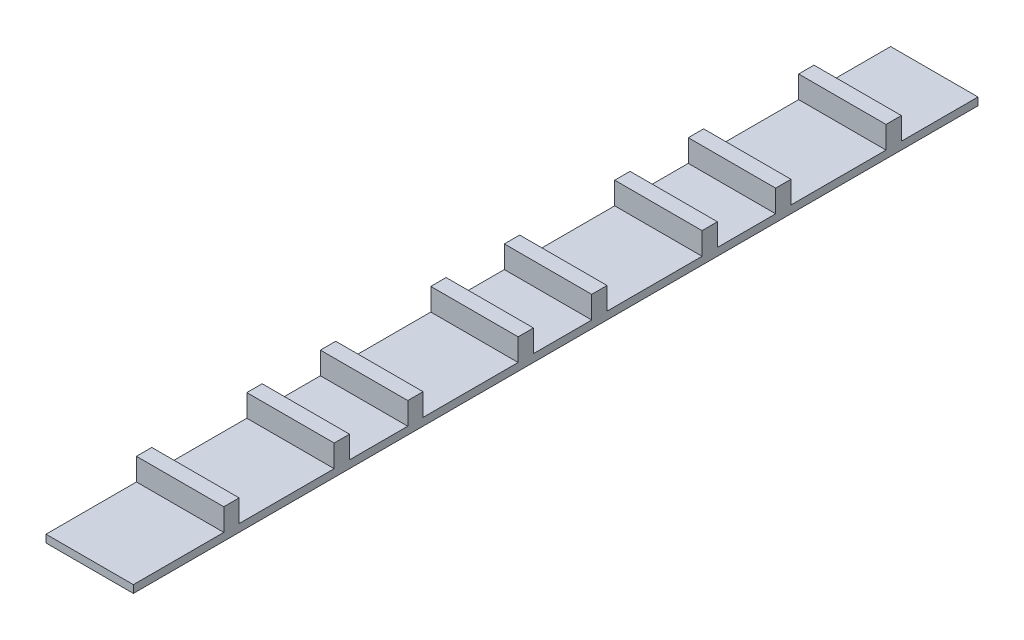
ISO-10303-21;
HEADER;
FILE_DESCRIPTION(('STEP AP214'),'2;1');
FILE_NAME('part.step','',(''),(''),'','','');
FILE_SCHEMA(('AUTOMOTIVE_DESIGN { 1 0 10303 214 1 1 1 1 }'));
ENDSEC;
DATA;
#1=APPLICATION_CONTEXT('core data for automotive mechanical design processes');
#2=APPLICATION_PROTOCOL_DEFINITION('international standard','automotive_design',2000,#1);
#3=PRODUCT_CONTEXT('',#1,'mechanical');
#4=PRODUCT('Part','Part','',(#3));
#5=PRODUCT_RELATED_PRODUCT_CATEGORY('part','',(#4));
#6=PRODUCT_DEFINITION_FORMATION('','',#4);
#7=PRODUCT_DEFINITION_CONTEXT('part definition',#1,'design');
#8=PRODUCT_DEFINITION('design','',#6,#7);
#9=PRODUCT_DEFINITION_SHAPE('','',#8);
#10=(LENGTH_UNIT() NAMED_UNIT(*) SI_UNIT(.MILLI.,.METRE.));
#11=(NAMED_UNIT(*) PLANE_ANGLE_UNIT() SI_UNIT($,.RADIAN.));
#12=(NAMED_UNIT(*) SI_UNIT($,.STERADIAN.) SOLID_ANGLE_UNIT());
#13=UNCERTAINTY_MEASURE_WITH_UNIT(LENGTH_MEASURE(1.E-05),#10,'distance_accuracy_value','');
#14=(GEOMETRIC_REPRESENTATION_CONTEXT(3) GLOBAL_UNCERTAINTY_ASSIGNED_CONTEXT((#13)) GLOBAL_UNIT_ASSIGNED_CONTEXT((#10,
#11,#12)) REPRESENTATION_CONTEXT('',''));
#15=CARTESIAN_POINT('',(0.,0.,0.));
#16=DIRECTION('',(0.,0.,1.));
#17=DIRECTION('',(1.,0.,0.));
#18=AXIS2_PLACEMENT_3D('',#15,#16,#17);
#19=CARTESIAN_POINT('',(0.,0.5,55.1));
#20=DIRECTION('',(0.,-1.,0.));
#21=DIRECTION('',(0.,0.,-1.));
#22=AXIS2_PLACEMENT_3D('',#19,#20,#21);
#23=PLANE('',#22);
#24=DIRECTION('',(1.,0.,0.));
#25=VECTOR('',#24,1.);
#26=CARTESIAN_POINT('',(0.,0.5,49.2));
#27=LINE('',#26,#25);
#28=CARTESIAN_POINT('',(0.,0.5,49.2));
#29=VERTEX_POINT('',#28);
#30=CARTESIAN_POINT('',(5.7,0.5,49.2));
#31=VERTEX_POINT('',#30);
#32=EDGE_CURVE('E65',#29,#31,#27,.T.);
#33=ORIENTED_EDGE('',*,*,#32,.F.);
#34=DIRECTION('',(0.,0.,-1.));
#35=VECTOR('',#34,1.);
#36=CARTESIAN_POINT('',(0.,0.5,55.1));
#37=LINE('',#36,#35);
#38=CARTESIAN_POINT('',(0.,0.5,55.1));
#39=VERTEX_POINT('',#38);
#40=EDGE_CURVE('E302',#39,#29,#37,.T.);
#41=ORIENTED_EDGE('',*,*,#40,.F.);
#42=DIRECTION('',(-1.,0.,0.));
#43=VECTOR('',#42,1.);
#44=CARTESIAN_POINT('',(0.,0.5,55.1));
#45=LINE('',#44,#43);
#46=CARTESIAN_POINT('',(5.7,0.5,55.1));
#47=VERTEX_POINT('',#46);
#48=EDGE_CURVE('E581',#47,#39,#45,.T.);
#49=ORIENTED_EDGE('',*,*,#48,.F.);
#50=DIRECTION('',(0.,0.,-1.));
#51=VECTOR('',#50,1.);
#52=CARTESIAN_POINT('',(5.7,0.5,55.1));
#53=LINE('',#52,#51);
#54=EDGE_CURVE('E600',#47,#31,#53,.T.);
#55=ORIENTED_EDGE('',*,*,#54,.T.);
#56=EDGE_LOOP('',(#33,#41,#49,#55));
#57=FACE_BOUND('',#56,.T.);
#58=ADVANCED_FACE('F41',(#57),#23,.F.);
#59=DIRECTION('',(-1.,0.,0.));
#60=VECTOR('',#59,1.);
#61=CARTESIAN_POINT('',(0.,0.5,48.2));
#62=LINE('',#61,#60);
#63=CARTESIAN_POINT('',(5.7,0.5,48.2));
#64=VERTEX_POINT('',#63);
#65=CARTESIAN_POINT('',(0.,0.5,48.2));
#66=VERTEX_POINT('',#65);
#67=EDGE_CURVE('E298',#64,#66,#62,.T.);
#68=ORIENTED_EDGE('',*,*,#67,.F.);
#69=CARTESIAN_POINT('',(5.7,0.5,42.));
#70=VERTEX_POINT('',#69);
#71=EDGE_CURVE('E602',#64,#70,#53,.T.);
#72=ORIENTED_EDGE('',*,*,#71,.T.);
#73=DIRECTION('',(1.,0.,0.));
#74=VECTOR('',#73,1.);
#75=CARTESIAN_POINT('',(0.,0.5,42.));
#76=LINE('',#75,#74);
#77=CARTESIAN_POINT('',(0.,0.5,42.));
#78=VERTEX_POINT('',#77);
#79=EDGE_CURVE('E304',#78,#70,#76,.T.);
#80=ORIENTED_EDGE('',*,*,#79,.F.);
#81=EDGE_CURVE('E57',#66,#78,#37,.T.);
#82=ORIENTED_EDGE('',*,*,#81,.F.);
#83=EDGE_LOOP('',(#68,#72,#80,#82));
#84=FACE_BOUND('',#83,.T.);
#85=ADVANCED_FACE('F652',(#84),#23,.F.);
#86=DIRECTION('',(-1.,0.,0.));
#87=VECTOR('',#86,1.);
#88=CARTESIAN_POINT('',(0.,0.5,41.));
#89=LINE('',#88,#87);
#90=CARTESIAN_POINT('',(5.7,0.5,41.));
#91=VERTEX_POINT('',#90);
#92=CARTESIAN_POINT('',(0.,0.5,41.));
#93=VERTEX_POINT('',#92);
#94=EDGE_CURVE('E309',#91,#93,#89,.T.);
#95=ORIENTED_EDGE('',*,*,#94,.F.);
#96=CARTESIAN_POINT('',(5.7,0.5,37.2));
#97=VERTEX_POINT('',#96);
#98=EDGE_CURVE('E643',#91,#97,#53,.T.);
#99=ORIENTED_EDGE('',*,*,#98,.T.);
#100=DIRECTION('',(1.,0.,0.));
#101=VECTOR('',#100,1.);
#102=CARTESIAN_POINT('',(0.,0.5,37.2));
#103=LINE('',#102,#101);
#104=CARTESIAN_POINT('',(0.,0.5,37.2));
#105=VERTEX_POINT('',#104);
#106=EDGE_CURVE('E347',#105,#97,#103,.T.);
#107=ORIENTED_EDGE('',*,*,#106,.F.);
#108=EDGE_CURVE('E668',#93,#105,#37,.T.);
#109=ORIENTED_EDGE('',*,*,#108,.F.);
#110=EDGE_LOOP('',(#95,#99,#107,#109));
#111=FACE_BOUND('',#110,.T.);
#112=ADVANCED_FACE('F764',(#111),#23,.F.);
#113=DIRECTION('',(-1.,0.,0.));
#114=VECTOR('',#113,1.);
#115=CARTESIAN_POINT('',(0.,0.5,36.2));
#116=LINE('',#115,#114);
#117=CARTESIAN_POINT('',(5.7,0.5,36.2));
#118=VERTEX_POINT('',#117);
#119=CARTESIAN_POINT('',(0.,0.5,36.2));
#120=VERTEX_POINT('',#119);
#121=EDGE_CURVE('E353',#118,#120,#116,.T.);
#122=ORIENTED_EDGE('',*,*,#121,.F.);
#123=CARTESIAN_POINT('',(5.7,0.5,30.));
#124=VERTEX_POINT('',#123);
#125=EDGE_CURVE('E638',#118,#124,#53,.T.);
#126=ORIENTED_EDGE('',*,*,#125,.T.);
#127=DIRECTION('',(1.,0.,0.));
#128=VECTOR('',#127,1.);
#129=CARTESIAN_POINT('',(0.,0.5,30.));
#130=LINE('',#129,#128);
#131=CARTESIAN_POINT('',(0.,0.5,30.));
#132=VERTEX_POINT('',#131);
#133=EDGE_CURVE('E384',#132,#124,#130,.T.);
#134=ORIENTED_EDGE('',*,*,#133,.F.);
#135=EDGE_CURVE('E670',#120,#132,#37,.T.);
#136=ORIENTED_EDGE('',*,*,#135,.F.);
#137=EDGE_LOOP('',(#122,#126,#134,#136));
#138=FACE_BOUND('',#137,.T.);
#139=ADVANCED_FACE('F752',(#138),#23,.F.);
#140=DIRECTION('',(-1.,0.,0.));
#141=VECTOR('',#140,1.);
#142=CARTESIAN_POINT('',(0.,0.5,29.));
#143=LINE('',#142,#141);
#144=CARTESIAN_POINT('',(5.7,0.5,29.));
#145=VERTEX_POINT('',#144);
#146=CARTESIAN_POINT('',(0.,0.5,29.));
#147=VERTEX_POINT('',#146);
#148=EDGE_CURVE('E390',#145,#147,#143,.T.);
#149=ORIENTED_EDGE('',*,*,#148,.F.);
#150=CARTESIAN_POINT('',(5.7,0.5,25.2));
#151=VERTEX_POINT('',#150);
#152=EDGE_CURVE('E633',#145,#151,#53,.T.);
#153=ORIENTED_EDGE('',*,*,#152,.T.);
#154=DIRECTION('',(1.,0.,0.));
#155=VECTOR('',#154,1.);
#156=CARTESIAN_POINT('',(0.,0.5,25.2));
#157=LINE('',#156,#155);
#158=CARTESIAN_POINT('',(0.,0.5,25.2));
#159=VERTEX_POINT('',#158);
#160=EDGE_CURVE('E421',#159,#151,#157,.T.);
#161=ORIENTED_EDGE('',*,*,#160,.F.);
#162=EDGE_CURVE('E673',#147,#159,#37,.T.);
#163=ORIENTED_EDGE('',*,*,#162,.F.);
#164=EDGE_LOOP('',(#149,#153,#161,#163));
#165=FACE_BOUND('',#164,.T.);
#166=ADVANCED_FACE('F739',(#165),#23,.F.);
#167=DIRECTION('',(-1.,0.,0.));
#168=VECTOR('',#167,1.);
#169=CARTESIAN_POINT('',(0.,0.5,24.2));
#170=LINE('',#169,#168);
#171=CARTESIAN_POINT('',(5.7,0.5,24.2));
#172=VERTEX_POINT('',#171);
#173=CARTESIAN_POINT('',(0.,0.5,24.2));
#174=VERTEX_POINT('',#173);
#175=EDGE_CURVE('E427',#172,#174,#170,.T.);
#176=ORIENTED_EDGE('',*,*,#175,.F.);
#177=CARTESIAN_POINT('',(5.7,0.5,18.));
#178=VERTEX_POINT('',#177);
#179=EDGE_CURVE('E628',#172,#178,#53,.T.);
#180=ORIENTED_EDGE('',*,*,#179,.T.);
#181=DIRECTION('',(1.,0.,0.));
#182=VECTOR('',#181,1.);
#183=CARTESIAN_POINT('',(0.,0.5,18.));
#184=LINE('',#183,#182);
#185=CARTESIAN_POINT('',(0.,0.5,18.));
#186=VERTEX_POINT('',#185);
#187=EDGE_CURVE('E458',#186,#178,#184,.T.);
#188=ORIENTED_EDGE('',*,*,#187,.F.);
#189=EDGE_CURVE('E676',#174,#186,#37,.T.);
#190=ORIENTED_EDGE('',*,*,#189,.F.);
#191=EDGE_LOOP('',(#176,#180,#188,#190));
#192=FACE_BOUND('',#191,.T.);
#193=ADVANCED_FACE('F726',(#192),#23,.F.);
#194=DIRECTION('',(-1.,0.,0.));
#195=VECTOR('',#194,1.);
#196=CARTESIAN_POINT('',(0.,0.5,17.));
#197=LINE('',#196,#195);
#198=CARTESIAN_POINT('',(5.7,0.5,17.));
#199=VERTEX_POINT('',#198);
#200=CARTESIAN_POINT('',(0.,0.5,17.));
#201=VERTEX_POINT('',#200);
#202=EDGE_CURVE('E464',#199,#201,#197,.T.);
#203=ORIENTED_EDGE('',*,*,#202,.F.);
#204=CARTESIAN_POINT('',(5.7,0.5,13.2));
#205=VERTEX_POINT('',#204);
#206=EDGE_CURVE('E623',#199,#205,#53,.T.);
#207=ORIENTED_EDGE('',*,*,#206,.T.);
#208=DIRECTION('',(1.,0.,0.));
#209=VECTOR('',#208,1.);
#210=CARTESIAN_POINT('',(0.,0.5,13.2));
#211=LINE('',#210,#209);
#212=CARTESIAN_POINT('',(0.,0.5,13.2));
#213=VERTEX_POINT('',#212);
#214=EDGE_CURVE('E495',#213,#205,#211,.T.);
#215=ORIENTED_EDGE('',*,*,#214,.F.);
#216=EDGE_CURVE('E679',#201,#213,#37,.T.);
#217=ORIENTED_EDGE('',*,*,#216,.F.);
#218=EDGE_LOOP('',(#203,#207,#215,#217));
#219=FACE_BOUND('',#218,.T.);
#220=ADVANCED_FACE('F713',(#219),#23,.F.);
#221=DIRECTION('',(-1.,0.,0.));
#222=VECTOR('',#221,1.);
#223=CARTESIAN_POINT('',(0.,0.5,12.2));
#224=LINE('',#223,#222);
#225=CARTESIAN_POINT('',(5.7,0.5,12.2));
#226=VERTEX_POINT('',#225);
#227=CARTESIAN_POINT('',(0.,0.5,12.2));
#228=VERTEX_POINT('',#227);
#229=EDGE_CURVE('E501',#226,#228,#224,.T.);
#230=ORIENTED_EDGE('',*,*,#229,.F.);
#231=CARTESIAN_POINT('',(5.7,0.5,6.));
#232=VERTEX_POINT('',#231);
#233=EDGE_CURVE('E621',#226,#232,#53,.T.);
#234=ORIENTED_EDGE('',*,*,#233,.T.);
#235=DIRECTION('',(1.,0.,0.));
#236=VECTOR('',#235,1.);
#237=CARTESIAN_POINT('',(0.,0.5,6.));
#238=LINE('',#237,#236);
#239=CARTESIAN_POINT('',(0.,0.5,6.));
#240=VERTEX_POINT('',#239);
#241=EDGE_CURVE('E532',#240,#232,#238,.T.);
#242=ORIENTED_EDGE('',*,*,#241,.F.);
#243=EDGE_CURVE('E682',#228,#240,#37,.T.);
#244=ORIENTED_EDGE('',*,*,#243,.F.);
#245=EDGE_LOOP('',(#230,#234,#242,#244));
#246=FACE_BOUND('',#245,.T.);
#247=ADVANCED_FACE('F699',(#246),#23,.F.);
#248=DIRECTION('',(-1.,0.,0.));
#249=VECTOR('',#248,1.);
#250=CARTESIAN_POINT('',(0.,0.5,5.));
#251=LINE('',#250,#249);
#252=CARTESIAN_POINT('',(5.7,0.5,5.));
#253=VERTEX_POINT('',#252);
#254=CARTESIAN_POINT('',(0.,0.5,5.));
#255=VERTEX_POINT('',#254);
#256=EDGE_CURVE('E538',#253,#255,#251,.T.);
#257=ORIENTED_EDGE('',*,*,#256,.F.);
#258=CARTESIAN_POINT('',(5.7,0.5,0.));
#259=VERTEX_POINT('',#258);
#260=EDGE_CURVE('E599',#253,#259,#53,.T.);
#261=ORIENTED_EDGE('',*,*,#260,.T.);
#262=DIRECTION('',(-1.,0.,0.));
#263=VECTOR('',#262,1.);
#264=CARTESIAN_POINT('',(0.,0.5,0.));
#265=LINE('',#264,#263);
#266=CARTESIAN_POINT('',(0.,0.5,0.));
#267=VERTEX_POINT('',#266);
#268=EDGE_CURVE('E575',#259,#267,#265,.T.);
#269=ORIENTED_EDGE('',*,*,#268,.T.);
#270=EDGE_CURVE('E584',#255,#267,#37,.T.);
#271=ORIENTED_EDGE('',*,*,#270,.F.);
#272=EDGE_LOOP('',(#257,#261,#269,#271));
#273=FACE_BOUND('',#272,.T.);
#274=ADVANCED_FACE('F618',(#273),#23,.F.);
#275=CARTESIAN_POINT('',(0.,0.,55.1));
#276=DIRECTION('',(1.,0.,0.));
#277=DIRECTION('',(0.,0.,-1.));
#278=AXIS2_PLACEMENT_3D('',#275,#276,#277);
#279=PLANE('',#278);
#280=DIRECTION('',(0.,-1.,0.));
#281=VECTOR('',#280,1.);
#282=CARTESIAN_POINT('',(0.,0.,0.));
#283=LINE('',#282,#281);
#284=CARTESIAN_POINT('',(0.,0.,0.));
#285=VERTEX_POINT('',#284);
#286=EDGE_CURVE('E569',#267,#285,#283,.T.);
#287=ORIENTED_EDGE('',*,*,#286,.T.);
#288=DIRECTION('',(0.,0.,-1.));
#289=VECTOR('',#288,1.);
#290=CARTESIAN_POINT('',(0.,0.,55.1));
#291=LINE('',#290,#289);
#292=CARTESIAN_POINT('',(0.,0.,55.1));
#293=VERTEX_POINT('',#292);
#294=EDGE_CURVE('E11',#293,#285,#291,.T.);
#295=ORIENTED_EDGE('',*,*,#294,.F.);
#296=DIRECTION('',(0.,-1.,0.));
#297=VECTOR('',#296,1.);
#298=CARTESIAN_POINT('',(0.,0.,55.1));
#299=LINE('',#298,#297);
#300=EDGE_CURVE('E570',#39,#293,#299,.T.);
#301=ORIENTED_EDGE('',*,*,#300,.F.);
#302=ORIENTED_EDGE('',*,*,#40,.T.);
#303=DIRECTION('',(0.,-1.,0.));
#304=VECTOR('',#303,1.);
#305=CARTESIAN_POINT('',(0.,1.95,49.2));
#306=LINE('',#305,#304);
#307=CARTESIAN_POINT('',(0.,1.95,49.2));
#308=VERTEX_POINT('',#307);
#309=EDGE_CURVE('E281',#308,#29,#306,.T.);
#310=ORIENTED_EDGE('',*,*,#309,.F.);
#311=DIRECTION('',(0.,0.,1.));
#312=VECTOR('',#311,1.);
#313=CARTESIAN_POINT('',(0.,1.95,48.2));
#314=LINE('',#313,#312);
#315=CARTESIAN_POINT('',(0.,1.95,48.2));
#316=VERTEX_POINT('',#315);
#317=EDGE_CURVE('E288',#316,#308,#314,.T.);
#318=ORIENTED_EDGE('',*,*,#317,.F.);
#319=DIRECTION('',(0.,-1.,0.));
#320=VECTOR('',#319,1.);
#321=CARTESIAN_POINT('',(0.,1.95,48.2));
#322=LINE('',#321,#320);
#323=EDGE_CURVE('E666',#316,#66,#322,.T.);
#324=ORIENTED_EDGE('',*,*,#323,.T.);
#325=ORIENTED_EDGE('',*,*,#81,.T.);
#326=DIRECTION('',(0.,-1.,0.));
#327=VECTOR('',#326,1.);
#328=CARTESIAN_POINT('',(0.,1.95,42.));
#329=LINE('',#328,#327);
#330=CARTESIAN_POINT('',(0.,1.95,42.));
#331=VERTEX_POINT('',#330);
#332=EDGE_CURVE('E343',#331,#78,#329,.T.);
#333=ORIENTED_EDGE('',*,*,#332,.F.);
#334=DIRECTION('',(0.,0.,1.));
#335=VECTOR('',#334,1.);
#336=CARTESIAN_POINT('',(0.,1.95,41.));
#337=LINE('',#336,#335);
#338=CARTESIAN_POINT('',(0.,1.95,41.));
#339=VERTEX_POINT('',#338);
#340=EDGE_CURVE('E315',#339,#331,#337,.T.);
#341=ORIENTED_EDGE('',*,*,#340,.F.);
#342=DIRECTION('',(0.,-1.,0.));
#343=VECTOR('',#342,1.);
#344=CARTESIAN_POINT('',(0.,1.95,41.));
#345=LINE('',#344,#343);
#346=EDGE_CURVE('E327',#339,#93,#345,.T.);
#347=ORIENTED_EDGE('',*,*,#346,.T.);
#348=ORIENTED_EDGE('',*,*,#108,.T.);
#349=DIRECTION('',(0.,-1.,0.));
#350=VECTOR('',#349,1.);
#351=CARTESIAN_POINT('',(0.,1.95,37.2));
#352=LINE('',#351,#350);
#353=CARTESIAN_POINT('',(0.,1.95,37.2));
#354=VERTEX_POINT('',#353);
#355=EDGE_CURVE('E380',#354,#105,#352,.T.);
#356=ORIENTED_EDGE('',*,*,#355,.F.);
#357=DIRECTION('',(0.,0.,1.));
#358=VECTOR('',#357,1.);
#359=CARTESIAN_POINT('',(0.,1.95,36.2));
#360=LINE('',#359,#358);
#361=CARTESIAN_POINT('',(0.,1.95,36.2));
#362=VERTEX_POINT('',#361);
#363=EDGE_CURVE('E348',#362,#354,#360,.T.);
#364=ORIENTED_EDGE('',*,*,#363,.F.);
#365=DIRECTION('',(0.,-1.,0.));
#366=VECTOR('',#365,1.);
#367=CARTESIAN_POINT('',(0.,1.95,36.2));
#368=LINE('',#367,#366);
#369=EDGE_CURVE('E362',#362,#120,#368,.T.);
#370=ORIENTED_EDGE('',*,*,#369,.T.);
#371=ORIENTED_EDGE('',*,*,#135,.T.);
#372=DIRECTION('',(0.,-1.,0.));
#373=VECTOR('',#372,1.);
#374=CARTESIAN_POINT('',(0.,1.95,30.));
#375=LINE('',#374,#373);
#376=CARTESIAN_POINT('',(0.,1.95,30.));
#377=VERTEX_POINT('',#376);
#378=EDGE_CURVE('E417',#377,#132,#375,.T.);
#379=ORIENTED_EDGE('',*,*,#378,.F.);
#380=DIRECTION('',(0.,0.,1.));
#381=VECTOR('',#380,1.);
#382=CARTESIAN_POINT('',(0.,1.95,29.));
#383=LINE('',#382,#381);
#384=CARTESIAN_POINT('',(0.,1.95,29.));
#385=VERTEX_POINT('',#384);
#386=EDGE_CURVE('E385',#385,#377,#383,.T.);
#387=ORIENTED_EDGE('',*,*,#386,.F.);
#388=DIRECTION('',(0.,-1.,0.));
#389=VECTOR('',#388,1.);
#390=CARTESIAN_POINT('',(0.,1.95,29.));
#391=LINE('',#390,#389);
#392=EDGE_CURVE('E399',#385,#147,#391,.T.);
#393=ORIENTED_EDGE('',*,*,#392,.T.);
#394=ORIENTED_EDGE('',*,*,#162,.T.);
#395=DIRECTION('',(0.,-1.,0.));
#396=VECTOR('',#395,1.);
#397=CARTESIAN_POINT('',(0.,1.95,25.2));
#398=LINE('',#397,#396);
#399=CARTESIAN_POINT('',(0.,1.95,25.2));
#400=VERTEX_POINT('',#399);
#401=EDGE_CURVE('E454',#400,#159,#398,.T.);
#402=ORIENTED_EDGE('',*,*,#401,.F.);
#403=DIRECTION('',(0.,0.,1.));
#404=VECTOR('',#403,1.);
#405=CARTESIAN_POINT('',(0.,1.95,24.2));
#406=LINE('',#405,#404);
#407=CARTESIAN_POINT('',(0.,1.95,24.2));
#408=VERTEX_POINT('',#407);
#409=EDGE_CURVE('E422',#408,#400,#406,.T.);
#410=ORIENTED_EDGE('',*,*,#409,.F.);
#411=DIRECTION('',(0.,-1.,0.));
#412=VECTOR('',#411,1.);
#413=CARTESIAN_POINT('',(0.,1.95,24.2));
#414=LINE('',#413,#412);
#415=EDGE_CURVE('E436',#408,#174,#414,.T.);
#416=ORIENTED_EDGE('',*,*,#415,.T.);
#417=ORIENTED_EDGE('',*,*,#189,.T.);
#418=DIRECTION('',(0.,-1.,0.));
#419=VECTOR('',#418,1.);
#420=CARTESIAN_POINT('',(0.,1.95,18.));
#421=LINE('',#420,#419);
#422=CARTESIAN_POINT('',(0.,1.95,18.));
#423=VERTEX_POINT('',#422);
#424=EDGE_CURVE('E491',#423,#186,#421,.T.);
#425=ORIENTED_EDGE('',*,*,#424,.F.);
#426=DIRECTION('',(0.,0.,1.));
#427=VECTOR('',#426,1.);
#428=CARTESIAN_POINT('',(0.,1.95,17.));
#429=LINE('',#428,#427);
#430=CARTESIAN_POINT('',(0.,1.95,17.));
#431=VERTEX_POINT('',#430);
#432=EDGE_CURVE('E459',#431,#423,#429,.T.);
#433=ORIENTED_EDGE('',*,*,#432,.F.);
#434=DIRECTION('',(0.,-1.,0.));
#435=VECTOR('',#434,1.);
#436=CARTESIAN_POINT('',(0.,1.95,17.));
#437=LINE('',#436,#435);
#438=EDGE_CURVE('E473',#431,#201,#437,.T.);
#439=ORIENTED_EDGE('',*,*,#438,.T.);
#440=ORIENTED_EDGE('',*,*,#216,.T.);
#441=DIRECTION('',(0.,-1.,0.));
#442=VECTOR('',#441,1.);
#443=CARTESIAN_POINT('',(0.,1.95,13.2));
#444=LINE('',#443,#442);
#445=CARTESIAN_POINT('',(0.,1.95,13.2));
#446=VERTEX_POINT('',#445);
#447=EDGE_CURVE('E528',#446,#213,#444,.T.);
#448=ORIENTED_EDGE('',*,*,#447,.F.);
#449=DIRECTION('',(0.,0.,1.));
#450=VECTOR('',#449,1.);
#451=CARTESIAN_POINT('',(0.,1.95,12.2));
#452=LINE('',#451,#450);
#453=CARTESIAN_POINT('',(0.,1.95,12.2));
#454=VERTEX_POINT('',#453);
#455=EDGE_CURVE('E496',#454,#446,#452,.T.);
#456=ORIENTED_EDGE('',*,*,#455,.F.);
#457=DIRECTION('',(0.,-1.,0.));
#458=VECTOR('',#457,1.);
#459=CARTESIAN_POINT('',(0.,1.95,12.2));
#460=LINE('',#459,#458);
#461=EDGE_CURVE('E510',#454,#228,#460,.T.);
#462=ORIENTED_EDGE('',*,*,#461,.T.);
#463=ORIENTED_EDGE('',*,*,#243,.T.);
#464=DIRECTION('',(0.,-1.,0.));
#465=VECTOR('',#464,1.);
#466=CARTESIAN_POINT('',(0.,1.95,6.));
#467=LINE('',#466,#465);
#468=CARTESIAN_POINT('',(0.,1.95,6.));
#469=VERTEX_POINT('',#468);
#470=EDGE_CURVE('E565',#469,#240,#467,.T.);
#471=ORIENTED_EDGE('',*,*,#470,.F.);
#472=DIRECTION('',(0.,0.,1.));
#473=VECTOR('',#472,1.);
#474=CARTESIAN_POINT('',(0.,1.95,5.));
#475=LINE('',#474,#473);
#476=CARTESIAN_POINT('',(0.,1.95,5.));
#477=VERTEX_POINT('',#476);
#478=EDGE_CURVE('E533',#477,#469,#475,.T.);
#479=ORIENTED_EDGE('',*,*,#478,.F.);
#480=DIRECTION('',(0.,-1.,0.));
#481=VECTOR('',#480,1.);
#482=CARTESIAN_POINT('',(0.,1.95,5.));
#483=LINE('',#482,#481);
#484=EDGE_CURVE('E547',#477,#255,#483,.T.);
#485=ORIENTED_EDGE('',*,*,#484,.T.);
#486=ORIENTED_EDGE('',*,*,#270,.T.);
#487=EDGE_LOOP('',(#287,#295,#301,#302,#310,#318,#324,#325,#333,#341,#347,#348,#356,#364,#370,
#371,#379,#387,#393,#394,#402,#410,#416,#417,#425,#433,#439,#440,#448,#456,#462,#463,#471,#479,
#485,#486));
#488=FACE_BOUND('',#487,.T.);
#489=ADVANCED_FACE('F43',(#488),#279,.F.);
#490=CARTESIAN_POINT('',(0.,0.,55.1));
#491=DIRECTION('',(0.,1.,0.));
#492=DIRECTION('',(0.,0.,1.));
#493=AXIS2_PLACEMENT_3D('',#490,#491,#492);
#494=PLANE('',#493);
#495=DIRECTION('',(1.,0.,0.));
#496=VECTOR('',#495,1.);
#497=CARTESIAN_POINT('',(0.,0.,0.));
#498=LINE('',#497,#496);
#499=CARTESIAN_POINT('',(5.7,0.,0.));
#500=VERTEX_POINT('',#499);
#501=EDGE_CURVE('E587',#285,#500,#498,.T.);
#502=ORIENTED_EDGE('',*,*,#501,.T.);
#503=DIRECTION('',(0.,0.,-1.));
#504=VECTOR('',#503,1.);
#505=CARTESIAN_POINT('',(5.7,0.,55.1));
#506=LINE('',#505,#504);
#507=CARTESIAN_POINT('',(5.7,0.,55.1));
#508=VERTEX_POINT('',#507);
#509=EDGE_CURVE('E50',#508,#500,#506,.T.);
#510=ORIENTED_EDGE('',*,*,#509,.F.);
#511=DIRECTION('',(1.,0.,0.));
#512=VECTOR('',#511,1.);
#513=CARTESIAN_POINT('',(0.,0.,55.1));
#514=LINE('',#513,#512);
#515=EDGE_CURVE('E574',#293,#508,#514,.T.);
#516=ORIENTED_EDGE('',*,*,#515,.F.);
#517=ORIENTED_EDGE('',*,*,#294,.T.);
#518=EDGE_LOOP('',(#502,#510,#516,#517));
#519=FACE_BOUND('',#518,.T.);
#520=ADVANCED_FACE('F787',(#519),#494,.F.);
#521=CARTESIAN_POINT('',(5.7,0.,55.1));
#522=DIRECTION('',(-1.,0.,0.));
#523=DIRECTION('',(0.,0.,1.));
#524=AXIS2_PLACEMENT_3D('',#521,#522,#523);
#525=PLANE('',#524);
#526=DIRECTION('',(0.,1.,0.));
#527=VECTOR('',#526,1.);
#528=CARTESIAN_POINT('',(5.7,0.,0.));
#529=LINE('',#528,#527);
#530=EDGE_CURVE('E590',#500,#259,#529,.T.);
#531=ORIENTED_EDGE('',*,*,#530,.T.);
#532=ORIENTED_EDGE('',*,*,#260,.F.);
#533=DIRECTION('',(0.,-1.,0.));
#534=VECTOR('',#533,1.);
#535=CARTESIAN_POINT('',(5.7,1.95,5.));
#536=LINE('',#535,#534);
#537=CARTESIAN_POINT('',(5.7,1.95,5.));
#538=VERTEX_POINT('',#537);
#539=EDGE_CURVE('E557',#538,#253,#536,.T.);
#540=ORIENTED_EDGE('',*,*,#539,.F.);
#541=DIRECTION('',(0.,0.,-1.));
#542=VECTOR('',#541,1.);
#543=CARTESIAN_POINT('',(5.7,1.95,5.));
#544=LINE('',#543,#542);
#545=CARTESIAN_POINT('',(5.7,1.95,6.));
#546=VERTEX_POINT('',#545);
#547=EDGE_CURVE('E541',#546,#538,#544,.T.);
#548=ORIENTED_EDGE('',*,*,#547,.F.);
#549=DIRECTION('',(0.,-1.,0.));
#550=VECTOR('',#549,1.);
#551=CARTESIAN_POINT('',(5.7,1.95,6.));
#552=LINE('',#551,#550);
#553=EDGE_CURVE('E561',#546,#232,#552,.T.);
#554=ORIENTED_EDGE('',*,*,#553,.T.);
#555=ORIENTED_EDGE('',*,*,#233,.F.);
#556=DIRECTION('',(0.,-1.,0.));
#557=VECTOR('',#556,1.);
#558=CARTESIAN_POINT('',(5.7,1.95,12.2));
#559=LINE('',#558,#557);
#560=CARTESIAN_POINT('',(5.7,1.95,12.2));
#561=VERTEX_POINT('',#560);
#562=EDGE_CURVE('E520',#561,#226,#559,.T.);
#563=ORIENTED_EDGE('',*,*,#562,.F.);
#564=DIRECTION('',(0.,0.,-1.));
#565=VECTOR('',#564,1.);
#566=CARTESIAN_POINT('',(5.7,1.95,12.2));
#567=LINE('',#566,#565);
#568=CARTESIAN_POINT('',(5.7,1.95,13.2));
#569=VERTEX_POINT('',#568);
#570=EDGE_CURVE('E504',#569,#561,#567,.T.);
#571=ORIENTED_EDGE('',*,*,#570,.F.);
#572=DIRECTION('',(0.,-1.,0.));
#573=VECTOR('',#572,1.);
#574=CARTESIAN_POINT('',(5.7,1.95,13.2));
#575=LINE('',#574,#573);
#576=EDGE_CURVE('E524',#569,#205,#575,.T.);
#577=ORIENTED_EDGE('',*,*,#576,.T.);
#578=ORIENTED_EDGE('',*,*,#206,.F.);
#579=DIRECTION('',(0.,-1.,0.));
#580=VECTOR('',#579,1.);
#581=CARTESIAN_POINT('',(5.7,1.95,17.));
#582=LINE('',#581,#580);
#583=CARTESIAN_POINT('',(5.7,1.95,17.));
#584=VERTEX_POINT('',#583);
#585=EDGE_CURVE('E483',#584,#199,#582,.T.);
#586=ORIENTED_EDGE('',*,*,#585,.F.);
#587=DIRECTION('',(0.,0.,-1.));
#588=VECTOR('',#587,1.);
#589=CARTESIAN_POINT('',(5.7,1.95,17.));
#590=LINE('',#589,#588);
#591=CARTESIAN_POINT('',(5.7,1.95,18.));
#592=VERTEX_POINT('',#591);
#593=EDGE_CURVE('E467',#592,#584,#590,.T.);
#594=ORIENTED_EDGE('',*,*,#593,.F.);
#595=DIRECTION('',(0.,-1.,0.));
#596=VECTOR('',#595,1.);
#597=CARTESIAN_POINT('',(5.7,1.95,18.));
#598=LINE('',#597,#596);
#599=EDGE_CURVE('E487',#592,#178,#598,.T.);
#600=ORIENTED_EDGE('',*,*,#599,.T.);
#601=ORIENTED_EDGE('',*,*,#179,.F.);
#602=DIRECTION('',(0.,-1.,0.));
#603=VECTOR('',#602,1.);
#604=CARTESIAN_POINT('',(5.7,1.95,24.2));
#605=LINE('',#604,#603);
#606=CARTESIAN_POINT('',(5.7,1.95,24.2));
#607=VERTEX_POINT('',#606);
#608=EDGE_CURVE('E446',#607,#172,#605,.T.);
#609=ORIENTED_EDGE('',*,*,#608,.F.);
#610=DIRECTION('',(0.,0.,-1.));
#611=VECTOR('',#610,1.);
#612=CARTESIAN_POINT('',(5.7,1.95,24.2));
#613=LINE('',#612,#611);
#614=CARTESIAN_POINT('',(5.7,1.95,25.2));
#615=VERTEX_POINT('',#614);
#616=EDGE_CURVE('E430',#615,#607,#613,.T.);
#617=ORIENTED_EDGE('',*,*,#616,.F.);
#618=DIRECTION('',(0.,-1.,0.));
#619=VECTOR('',#618,1.);
#620=CARTESIAN_POINT('',(5.7,1.95,25.2));
#621=LINE('',#620,#619);
#622=EDGE_CURVE('E450',#615,#151,#621,.T.);
#623=ORIENTED_EDGE('',*,*,#622,.T.);
#624=ORIENTED_EDGE('',*,*,#152,.F.);
#625=DIRECTION('',(0.,-1.,0.));
#626=VECTOR('',#625,1.);
#627=CARTESIAN_POINT('',(5.7,1.95,29.));
#628=LINE('',#627,#626);
#629=CARTESIAN_POINT('',(5.7,1.95,29.));
#630=VERTEX_POINT('',#629);
#631=EDGE_CURVE('E409',#630,#145,#628,.T.);
#632=ORIENTED_EDGE('',*,*,#631,.F.);
#633=DIRECTION('',(0.,0.,-1.));
#634=VECTOR('',#633,1.);
#635=CARTESIAN_POINT('',(5.7,1.95,29.));
#636=LINE('',#635,#634);
#637=CARTESIAN_POINT('',(5.7,1.95,30.));
#638=VERTEX_POINT('',#637);
#639=EDGE_CURVE('E393',#638,#630,#636,.T.);
#640=ORIENTED_EDGE('',*,*,#639,.F.);
#641=DIRECTION('',(0.,-1.,0.));
#642=VECTOR('',#641,1.);
#643=CARTESIAN_POINT('',(5.7,1.95,30.));
#644=LINE('',#643,#642);
#645=EDGE_CURVE('E413',#638,#124,#644,.T.);
#646=ORIENTED_EDGE('',*,*,#645,.T.);
#647=ORIENTED_EDGE('',*,*,#125,.F.);
#648=DIRECTION('',(0.,-1.,0.));
#649=VECTOR('',#648,1.);
#650=CARTESIAN_POINT('',(5.7,1.95,36.2));
#651=LINE('',#650,#649);
#652=CARTESIAN_POINT('',(5.7,1.95,36.2));
#653=VERTEX_POINT('',#652);
#654=EDGE_CURVE('E372',#653,#118,#651,.T.);
#655=ORIENTED_EDGE('',*,*,#654,.F.);
#656=DIRECTION('',(0.,0.,-1.));
#657=VECTOR('',#656,1.);
#658=CARTESIAN_POINT('',(5.7,1.95,36.2));
#659=LINE('',#658,#657);
#660=CARTESIAN_POINT('',(5.7,1.95,37.2));
#661=VERTEX_POINT('',#660);
#662=EDGE_CURVE('E356',#661,#653,#659,.T.);
#663=ORIENTED_EDGE('',*,*,#662,.F.);
#664=DIRECTION('',(0.,-1.,0.));
#665=VECTOR('',#664,1.);
#666=CARTESIAN_POINT('',(5.7,1.95,37.2));
#667=LINE('',#666,#665);
#668=EDGE_CURVE('E376',#661,#97,#667,.T.);
#669=ORIENTED_EDGE('',*,*,#668,.T.);
#670=ORIENTED_EDGE('',*,*,#98,.F.);
#671=DIRECTION('',(0.,-1.,0.));
#672=VECTOR('',#671,1.);
#673=CARTESIAN_POINT('',(5.7,1.95,41.));
#674=LINE('',#673,#672);
#675=CARTESIAN_POINT('',(5.7,1.95,41.));
#676=VERTEX_POINT('',#675);
#677=EDGE_CURVE('E335',#676,#91,#674,.T.);
#678=ORIENTED_EDGE('',*,*,#677,.F.);
#679=DIRECTION('',(0.,0.,-1.));
#680=VECTOR('',#679,1.);
#681=CARTESIAN_POINT('',(5.7,1.95,41.));
#682=LINE('',#681,#680);
#683=CARTESIAN_POINT('',(5.7,1.95,42.));
#684=VERTEX_POINT('',#683);
#685=EDGE_CURVE('E322',#684,#676,#682,.T.);
#686=ORIENTED_EDGE('',*,*,#685,.F.);
#687=DIRECTION('',(0.,-1.,0.));
#688=VECTOR('',#687,1.);
#689=CARTESIAN_POINT('',(5.7,1.95,42.));
#690=LINE('',#689,#688);
#691=EDGE_CURVE('E339',#684,#70,#690,.T.);
#692=ORIENTED_EDGE('',*,*,#691,.T.);
#693=ORIENTED_EDGE('',*,*,#71,.F.);
#694=DIRECTION('',(0.,-1.,0.));
#695=VECTOR('',#694,1.);
#696=CARTESIAN_POINT('',(5.7,1.95,48.2));
#697=LINE('',#696,#695);
#698=CARTESIAN_POINT('',(5.7,1.95,48.2));
#699=VERTEX_POINT('',#698);
#700=EDGE_CURVE('E311',#699,#64,#697,.T.);
#701=ORIENTED_EDGE('',*,*,#700,.F.);
#702=DIRECTION('',(0.,0.,-1.));
#703=VECTOR('',#702,1.);
#704=CARTESIAN_POINT('',(5.7,1.95,48.2));
#705=LINE('',#704,#703);
#706=CARTESIAN_POINT('',(5.7,1.95,49.2));
#707=VERTEX_POINT('',#706);
#708=EDGE_CURVE('E287',#707,#699,#705,.T.);
#709=ORIENTED_EDGE('',*,*,#708,.F.);
#710=DIRECTION('',(0.,-1.,0.));
#711=VECTOR('',#710,1.);
#712=CARTESIAN_POINT('',(5.7,1.95,49.2));
#713=LINE('',#712,#711);
#714=EDGE_CURVE('E283',#707,#31,#713,.T.);
#715=ORIENTED_EDGE('',*,*,#714,.T.);
#716=ORIENTED_EDGE('',*,*,#54,.F.);
#717=DIRECTION('',(0.,1.,0.));
#718=VECTOR('',#717,1.);
#719=CARTESIAN_POINT('',(5.7,0.,55.1));
#720=LINE('',#719,#718);
#721=EDGE_CURVE('E578',#508,#47,#720,.T.);
#722=ORIENTED_EDGE('',*,*,#721,.F.);
#723=ORIENTED_EDGE('',*,*,#509,.T.);
#724=EDGE_LOOP('',(#531,#532,#540,#548,#554,#555,#563,#571,#577,#578,#586,#594,#600,#601,#609,
#617,#623,#624,#632,#640,#646,#647,#655,#663,#669,#670,#678,#686,#692,#693,#701,#709,#715,#716,
#722,#723));
#725=FACE_BOUND('',#724,.T.);
#726=ADVANCED_FACE('F609',(#725),#525,.F.);
#727=CARTESIAN_POINT('',(0.,0.,55.1));
#728=DIRECTION('',(0.,0.,-1.));
#729=DIRECTION('',(-1.,0.,0.));
#730=AXIS2_PLACEMENT_3D('',#727,#728,#729);
#731=PLANE('',#730);
#732=ORIENTED_EDGE('',*,*,#300,.T.);
#733=ORIENTED_EDGE('',*,*,#515,.T.);
#734=ORIENTED_EDGE('',*,*,#721,.T.);
#735=ORIENTED_EDGE('',*,*,#48,.T.);
#736=EDGE_LOOP('',(#732,#733,#734,#735));
#737=FACE_BOUND('',#736,.T.);
#738=ADVANCED_FACE('F881',(#737),#731,.F.);
#739=CARTESIAN_POINT('',(0.,0.,0.));
#740=DIRECTION('',(0.,0.,-1.));
#741=DIRECTION('',(-1.,0.,0.));
#742=AXIS2_PLACEMENT_3D('',#739,#740,#741);
#743=PLANE('',#742);
#744=ORIENTED_EDGE('',*,*,#286,.F.);
#745=ORIENTED_EDGE('',*,*,#268,.F.);
#746=ORIENTED_EDGE('',*,*,#530,.F.);
#747=ORIENTED_EDGE('',*,*,#501,.F.);
#748=EDGE_LOOP('',(#744,#745,#746,#747));
#749=FACE_BOUND('',#748,.T.);
#750=ADVANCED_FACE('F616',(#749),#743,.T.);
#751=CARTESIAN_POINT('',(0.,1.95,6.));
#752=DIRECTION('',(0.,0.,-1.));
#753=DIRECTION('',(-1.,0.,0.));
#754=AXIS2_PLACEMENT_3D('',#751,#752,#753);
#755=PLANE('',#754);
#756=ORIENTED_EDGE('',*,*,#241,.T.);
#757=ORIENTED_EDGE('',*,*,#553,.F.);
#758=DIRECTION('',(1.,0.,0.));
#759=VECTOR('',#758,1.);
#760=CARTESIAN_POINT('',(0.,1.95,6.));
#761=LINE('',#760,#759);
#762=EDGE_CURVE('E537',#469,#546,#761,.T.);
#763=ORIENTED_EDGE('',*,*,#762,.F.);
#764=ORIENTED_EDGE('',*,*,#470,.T.);
#765=EDGE_LOOP('',(#756,#757,#763,#764));
#766=FACE_BOUND('',#765,.T.);
#767=ADVANCED_FACE('F698',(#766),#755,.F.);
#768=CARTESIAN_POINT('',(0.,1.95,5.));
#769=DIRECTION('',(0.,0.,1.));
#770=DIRECTION('',(1.,0.,0.));
#771=AXIS2_PLACEMENT_3D('',#768,#769,#770);
#772=PLANE('',#771);
#773=ORIENTED_EDGE('',*,*,#256,.T.);
#774=ORIENTED_EDGE('',*,*,#484,.F.);
#775=DIRECTION('',(-1.,0.,0.));
#776=VECTOR('',#775,1.);
#777=CARTESIAN_POINT('',(0.,1.95,5.));
#778=LINE('',#777,#776);
#779=EDGE_CURVE('E544',#538,#477,#778,.T.);
#780=ORIENTED_EDGE('',*,*,#779,.F.);
#781=ORIENTED_EDGE('',*,*,#539,.T.);
#782=EDGE_LOOP('',(#773,#774,#780,#781));
#783=FACE_BOUND('',#782,.T.);
#784=ADVANCED_FACE('F692',(#783),#772,.F.);
#785=CARTESIAN_POINT('',(0.,1.95,0.));
#786=DIRECTION('',(0.,1.,0.));
#787=DIRECTION('',(0.,0.,1.));
#788=AXIS2_PLACEMENT_3D('',#785,#786,#787);
#789=PLANE('',#788);
#790=ORIENTED_EDGE('',*,*,#478,.T.);
#791=ORIENTED_EDGE('',*,*,#762,.T.);
#792=ORIENTED_EDGE('',*,*,#547,.T.);
#793=ORIENTED_EDGE('',*,*,#779,.T.);
#794=EDGE_LOOP('',(#790,#791,#792,#793));
#795=FACE_BOUND('',#794,.T.);
#796=ADVANCED_FACE('F696',(#795),#789,.T.);
#797=CARTESIAN_POINT('',(0.,1.95,13.2));
#798=DIRECTION('',(0.,0.,-1.));
#799=DIRECTION('',(-1.,0.,0.));
#800=AXIS2_PLACEMENT_3D('',#797,#798,#799);
#801=PLANE('',#800);
#802=ORIENTED_EDGE('',*,*,#214,.T.);
#803=ORIENTED_EDGE('',*,*,#576,.F.);
#804=DIRECTION('',(1.,0.,0.));
#805=VECTOR('',#804,1.);
#806=CARTESIAN_POINT('',(0.,1.95,13.2));
#807=LINE('',#806,#805);
#808=EDGE_CURVE('E500',#446,#569,#807,.T.);
#809=ORIENTED_EDGE('',*,*,#808,.F.);
#810=ORIENTED_EDGE('',*,*,#447,.T.);
#811=EDGE_LOOP('',(#802,#803,#809,#810));
#812=FACE_BOUND('',#811,.T.);
#813=ADVANCED_FACE('F712',(#812),#801,.F.);
#814=CARTESIAN_POINT('',(0.,1.95,12.2));
#815=DIRECTION('',(0.,0.,1.));
#816=DIRECTION('',(1.,0.,0.));
#817=AXIS2_PLACEMENT_3D('',#814,#815,#816);
#818=PLANE('',#817);
#819=ORIENTED_EDGE('',*,*,#229,.T.);
#820=ORIENTED_EDGE('',*,*,#461,.F.);
#821=DIRECTION('',(-1.,0.,0.));
#822=VECTOR('',#821,1.);
#823=CARTESIAN_POINT('',(0.,1.95,12.2));
#824=LINE('',#823,#822);
#825=EDGE_CURVE('E507',#561,#454,#824,.T.);
#826=ORIENTED_EDGE('',*,*,#825,.F.);
#827=ORIENTED_EDGE('',*,*,#562,.T.);
#828=EDGE_LOOP('',(#819,#820,#826,#827));
#829=FACE_BOUND('',#828,.T.);
#830=ADVANCED_FACE('F702',(#829),#818,.F.);
#831=CARTESIAN_POINT('',(0.,1.95,0.));
#832=DIRECTION('',(0.,1.,0.));
#833=DIRECTION('',(0.,0.,1.));
#834=AXIS2_PLACEMENT_3D('',#831,#832,#833);
#835=PLANE('',#834);
#836=ORIENTED_EDGE('',*,*,#455,.T.);
#837=ORIENTED_EDGE('',*,*,#808,.T.);
#838=ORIENTED_EDGE('',*,*,#570,.T.);
#839=ORIENTED_EDGE('',*,*,#825,.T.);
#840=EDGE_LOOP('',(#836,#837,#838,#839));
#841=FACE_BOUND('',#840,.T.);
#842=ADVANCED_FACE('F707',(#841),#835,.T.);
#843=CARTESIAN_POINT('',(0.,1.95,18.));
#844=DIRECTION('',(0.,0.,-1.));
#845=DIRECTION('',(-1.,0.,0.));
#846=AXIS2_PLACEMENT_3D('',#843,#844,#845);
#847=PLANE('',#846);
#848=ORIENTED_EDGE('',*,*,#187,.T.);
#849=ORIENTED_EDGE('',*,*,#599,.F.);
#850=DIRECTION('',(1.,0.,0.));
#851=VECTOR('',#850,1.);
#852=CARTESIAN_POINT('',(0.,1.95,18.));
#853=LINE('',#852,#851);
#854=EDGE_CURVE('E463',#423,#592,#853,.T.);
#855=ORIENTED_EDGE('',*,*,#854,.F.);
#856=ORIENTED_EDGE('',*,*,#424,.T.);
#857=EDGE_LOOP('',(#848,#849,#855,#856));
#858=FACE_BOUND('',#857,.T.);
#859=ADVANCED_FACE('F725',(#858),#847,.F.);
#860=CARTESIAN_POINT('',(0.,1.95,17.));
#861=DIRECTION('',(0.,0.,1.));
#862=DIRECTION('',(1.,0.,0.));
#863=AXIS2_PLACEMENT_3D('',#860,#861,#862);
#864=PLANE('',#863);
#865=ORIENTED_EDGE('',*,*,#202,.T.);
#866=ORIENTED_EDGE('',*,*,#438,.F.);
#867=DIRECTION('',(-1.,0.,0.));
#868=VECTOR('',#867,1.);
#869=CARTESIAN_POINT('',(0.,1.95,17.));
#870=LINE('',#869,#868);
#871=EDGE_CURVE('E470',#584,#431,#870,.T.);
#872=ORIENTED_EDGE('',*,*,#871,.F.);
#873=ORIENTED_EDGE('',*,*,#585,.T.);
#874=EDGE_LOOP('',(#865,#866,#872,#873));
#875=FACE_BOUND('',#874,.T.);
#876=ADVANCED_FACE('F716',(#875),#864,.F.);
#877=CARTESIAN_POINT('',(0.,1.95,12.));
#878=DIRECTION('',(0.,1.,0.));
#879=DIRECTION('',(0.,0.,1.));
#880=AXIS2_PLACEMENT_3D('',#877,#878,#879);
#881=PLANE('',#880);
#882=ORIENTED_EDGE('',*,*,#432,.T.);
#883=ORIENTED_EDGE('',*,*,#854,.T.);
#884=ORIENTED_EDGE('',*,*,#593,.T.);
#885=ORIENTED_EDGE('',*,*,#871,.T.);
#886=EDGE_LOOP('',(#882,#883,#884,#885));
#887=FACE_BOUND('',#886,.T.);
#888=ADVANCED_FACE('F720',(#887),#881,.T.);
#889=CARTESIAN_POINT('',(0.,1.95,25.2));
#890=DIRECTION('',(0.,0.,-1.));
#891=DIRECTION('',(-1.,0.,0.));
#892=AXIS2_PLACEMENT_3D('',#889,#890,#891);
#893=PLANE('',#892);
#894=ORIENTED_EDGE('',*,*,#160,.T.);
#895=ORIENTED_EDGE('',*,*,#622,.F.);
#896=DIRECTION('',(1.,0.,0.));
#897=VECTOR('',#896,1.);
#898=CARTESIAN_POINT('',(0.,1.95,25.2));
#899=LINE('',#898,#897);
#900=EDGE_CURVE('E426',#400,#615,#899,.T.);
#901=ORIENTED_EDGE('',*,*,#900,.F.);
#902=ORIENTED_EDGE('',*,*,#401,.T.);
#903=EDGE_LOOP('',(#894,#895,#901,#902));
#904=FACE_BOUND('',#903,.T.);
#905=ADVANCED_FACE('F738',(#904),#893,.F.);
#906=CARTESIAN_POINT('',(0.,1.95,24.2));
#907=DIRECTION('',(0.,0.,1.));
#908=DIRECTION('',(1.,0.,0.));
#909=AXIS2_PLACEMENT_3D('',#906,#907,#908);
#910=PLANE('',#909);
#911=ORIENTED_EDGE('',*,*,#175,.T.);
#912=ORIENTED_EDGE('',*,*,#415,.F.);
#913=DIRECTION('',(-1.,0.,0.));
#914=VECTOR('',#913,1.);
#915=CARTESIAN_POINT('',(0.,1.95,24.2));
#916=LINE('',#915,#914);
#917=EDGE_CURVE('E433',#607,#408,#916,.T.);
#918=ORIENTED_EDGE('',*,*,#917,.F.);
#919=ORIENTED_EDGE('',*,*,#608,.T.);
#920=EDGE_LOOP('',(#911,#912,#918,#919));
#921=FACE_BOUND('',#920,.T.);
#922=ADVANCED_FACE('F729',(#921),#910,.F.);
#923=CARTESIAN_POINT('',(0.,1.95,12.));
#924=DIRECTION('',(0.,1.,0.));
#925=DIRECTION('',(0.,0.,1.));
#926=AXIS2_PLACEMENT_3D('',#923,#924,#925);
#927=PLANE('',#926);
#928=ORIENTED_EDGE('',*,*,#409,.T.);
#929=ORIENTED_EDGE('',*,*,#900,.T.);
#930=ORIENTED_EDGE('',*,*,#616,.T.);
#931=ORIENTED_EDGE('',*,*,#917,.T.);
#932=EDGE_LOOP('',(#928,#929,#930,#931));
#933=FACE_BOUND('',#932,.T.);
#934=ADVANCED_FACE('F733',(#933),#927,.T.);
#935=CARTESIAN_POINT('',(0.,1.95,30.));
#936=DIRECTION('',(0.,0.,-1.));
#937=DIRECTION('',(-1.,0.,0.));
#938=AXIS2_PLACEMENT_3D('',#935,#936,#937);
#939=PLANE('',#938);
#940=ORIENTED_EDGE('',*,*,#133,.T.);
#941=ORIENTED_EDGE('',*,*,#645,.F.);
#942=DIRECTION('',(1.,0.,0.));
#943=VECTOR('',#942,1.);
#944=CARTESIAN_POINT('',(0.,1.95,30.));
#945=LINE('',#944,#943);
#946=EDGE_CURVE('E389',#377,#638,#945,.T.);
#947=ORIENTED_EDGE('',*,*,#946,.F.);
#948=ORIENTED_EDGE('',*,*,#378,.T.);
#949=EDGE_LOOP('',(#940,#941,#947,#948));
#950=FACE_BOUND('',#949,.T.);
#951=ADVANCED_FACE('F751',(#950),#939,.F.);
#952=CARTESIAN_POINT('',(0.,1.95,29.));
#953=DIRECTION('',(0.,0.,1.));
#954=DIRECTION('',(1.,0.,0.));
#955=AXIS2_PLACEMENT_3D('',#952,#953,#954);
#956=PLANE('',#955);
#957=ORIENTED_EDGE('',*,*,#148,.T.);
#958=ORIENTED_EDGE('',*,*,#392,.F.);
#959=DIRECTION('',(-1.,0.,0.));
#960=VECTOR('',#959,1.);
#961=CARTESIAN_POINT('',(0.,1.95,29.));
#962=LINE('',#961,#960);
#963=EDGE_CURVE('E396',#630,#385,#962,.T.);
#964=ORIENTED_EDGE('',*,*,#963,.F.);
#965=ORIENTED_EDGE('',*,*,#631,.T.);
#966=EDGE_LOOP('',(#957,#958,#964,#965));
#967=FACE_BOUND('',#966,.T.);
#968=ADVANCED_FACE('F742',(#967),#956,.F.);
#969=CARTESIAN_POINT('',(0.,1.95,24.));
#970=DIRECTION('',(0.,1.,0.));
#971=DIRECTION('',(0.,0.,1.));
#972=AXIS2_PLACEMENT_3D('',#969,#970,#971);
#973=PLANE('',#972);
#974=ORIENTED_EDGE('',*,*,#386,.T.);
#975=ORIENTED_EDGE('',*,*,#946,.T.);
#976=ORIENTED_EDGE('',*,*,#639,.T.);
#977=ORIENTED_EDGE('',*,*,#963,.T.);
#978=EDGE_LOOP('',(#974,#975,#976,#977));
#979=FACE_BOUND('',#978,.T.);
#980=ADVANCED_FACE('F746',(#979),#973,.T.);
#981=CARTESIAN_POINT('',(0.,1.95,37.2));
#982=DIRECTION('',(0.,0.,-1.));
#983=DIRECTION('',(-1.,0.,0.));
#984=AXIS2_PLACEMENT_3D('',#981,#982,#983);
#985=PLANE('',#984);
#986=ORIENTED_EDGE('',*,*,#106,.T.);
#987=ORIENTED_EDGE('',*,*,#668,.F.);
#988=DIRECTION('',(1.,0.,0.));
#989=VECTOR('',#988,1.);
#990=CARTESIAN_POINT('',(0.,1.95,37.2));
#991=LINE('',#990,#989);
#992=EDGE_CURVE('E352',#354,#661,#991,.T.);
#993=ORIENTED_EDGE('',*,*,#992,.F.);
#994=ORIENTED_EDGE('',*,*,#355,.T.);
#995=EDGE_LOOP('',(#986,#987,#993,#994));
#996=FACE_BOUND('',#995,.T.);
#997=ADVANCED_FACE('F763',(#996),#985,.F.);
#998=CARTESIAN_POINT('',(0.,1.95,36.2));
#999=DIRECTION('',(0.,0.,1.));
#1000=DIRECTION('',(1.,0.,0.));
#1001=AXIS2_PLACEMENT_3D('',#998,#999,#1000);
#1002=PLANE('',#1001);
#1003=ORIENTED_EDGE('',*,*,#121,.T.);
#1004=ORIENTED_EDGE('',*,*,#369,.F.);
#1005=DIRECTION('',(-1.,0.,0.));
#1006=VECTOR('',#1005,1.);
#1007=CARTESIAN_POINT('',(0.,1.95,36.2));
#1008=LINE('',#1007,#1006);
#1009=EDGE_CURVE('E359',#653,#362,#1008,.T.);
#1010=ORIENTED_EDGE('',*,*,#1009,.F.);
#1011=ORIENTED_EDGE('',*,*,#654,.T.);
#1012=EDGE_LOOP('',(#1003,#1004,#1010,#1011));
#1013=FACE_BOUND('',#1012,.T.);
#1014=ADVANCED_FACE('F755',(#1013),#1002,.F.);
#1015=CARTESIAN_POINT('',(0.,1.95,24.));
#1016=DIRECTION('',(0.,1.,0.));
#1017=DIRECTION('',(0.,0.,1.));
#1018=AXIS2_PLACEMENT_3D('',#1015,#1016,#1017);
#1019=PLANE('',#1018);
#1020=ORIENTED_EDGE('',*,*,#363,.T.);
#1021=ORIENTED_EDGE('',*,*,#992,.T.);
#1022=ORIENTED_EDGE('',*,*,#662,.T.);
#1023=ORIENTED_EDGE('',*,*,#1009,.T.);
#1024=EDGE_LOOP('',(#1020,#1021,#1022,#1023));
#1025=FACE_BOUND('',#1024,.T.);
#1026=ADVANCED_FACE('F759',(#1025),#1019,.T.);
#1027=CARTESIAN_POINT('',(0.,1.95,42.));
#1028=DIRECTION('',(0.,0.,-1.));
#1029=DIRECTION('',(-1.,0.,0.));
#1030=AXIS2_PLACEMENT_3D('',#1027,#1028,#1029);
#1031=PLANE('',#1030);
#1032=ORIENTED_EDGE('',*,*,#79,.T.);
#1033=ORIENTED_EDGE('',*,*,#691,.F.);
#1034=DIRECTION('',(1.,0.,0.));
#1035=VECTOR('',#1034,1.);
#1036=CARTESIAN_POINT('',(0.,1.95,42.));
#1037=LINE('',#1036,#1035);
#1038=EDGE_CURVE('E319',#331,#684,#1037,.T.);
#1039=ORIENTED_EDGE('',*,*,#1038,.F.);
#1040=ORIENTED_EDGE('',*,*,#332,.T.);
#1041=EDGE_LOOP('',(#1032,#1033,#1039,#1040));
#1042=FACE_BOUND('',#1041,.T.);
#1043=ADVANCED_FACE('F657',(#1042),#1031,.F.);
#1044=CARTESIAN_POINT('',(0.,1.95,41.));
#1045=DIRECTION('',(0.,0.,1.));
#1046=DIRECTION('',(1.,0.,0.));
#1047=AXIS2_PLACEMENT_3D('',#1044,#1045,#1046);
#1048=PLANE('',#1047);
#1049=ORIENTED_EDGE('',*,*,#94,.T.);
#1050=ORIENTED_EDGE('',*,*,#346,.F.);
#1051=DIRECTION('',(-1.,0.,0.));
#1052=VECTOR('',#1051,1.);
#1053=CARTESIAN_POINT('',(0.,1.95,41.));
#1054=LINE('',#1053,#1052);
#1055=EDGE_CURVE('E325',#676,#339,#1054,.T.);
#1056=ORIENTED_EDGE('',*,*,#1055,.F.);
#1057=ORIENTED_EDGE('',*,*,#677,.T.);
#1058=EDGE_LOOP('',(#1049,#1050,#1056,#1057));
#1059=FACE_BOUND('',#1058,.T.);
#1060=ADVANCED_FACE('F766',(#1059),#1048,.F.);
#1061=CARTESIAN_POINT('',(0.,1.95,36.));
#1062=DIRECTION('',(0.,1.,0.));
#1063=DIRECTION('',(0.,0.,1.));
#1064=AXIS2_PLACEMENT_3D('',#1061,#1062,#1063);
#1065=PLANE('',#1064);
#1066=ORIENTED_EDGE('',*,*,#340,.T.);
#1067=ORIENTED_EDGE('',*,*,#1038,.T.);
#1068=ORIENTED_EDGE('',*,*,#685,.T.);
#1069=ORIENTED_EDGE('',*,*,#1055,.T.);
#1070=EDGE_LOOP('',(#1066,#1067,#1068,#1069));
#1071=FACE_BOUND('',#1070,.T.);
#1072=ADVANCED_FACE('F663',(#1071),#1065,.T.);
#1073=CARTESIAN_POINT('',(0.,1.95,49.2));
#1074=DIRECTION('',(0.,0.,-1.));
#1075=DIRECTION('',(-1.,0.,0.));
#1076=AXIS2_PLACEMENT_3D('',#1073,#1074,#1075);
#1077=PLANE('',#1076);
#1078=ORIENTED_EDGE('',*,*,#32,.T.);
#1079=ORIENTED_EDGE('',*,*,#714,.F.);
#1080=DIRECTION('',(1.,0.,0.));
#1081=VECTOR('',#1080,1.);
#1082=CARTESIAN_POINT('',(0.,1.95,49.2));
#1083=LINE('',#1082,#1081);
#1084=EDGE_CURVE('E277',#308,#707,#1083,.T.);
#1085=ORIENTED_EDGE('',*,*,#1084,.F.);
#1086=ORIENTED_EDGE('',*,*,#309,.T.);
#1087=EDGE_LOOP('',(#1078,#1079,#1085,#1086));
#1088=FACE_BOUND('',#1087,.T.);
#1089=ADVANCED_FACE('F279',(#1088),#1077,.F.);
#1090=CARTESIAN_POINT('',(0.,1.95,48.2));
#1091=DIRECTION('',(0.,0.,1.));
#1092=DIRECTION('',(1.,0.,0.));
#1093=AXIS2_PLACEMENT_3D('',#1090,#1091,#1092);
#1094=PLANE('',#1093);
#1095=ORIENTED_EDGE('',*,*,#67,.T.);
#1096=ORIENTED_EDGE('',*,*,#323,.F.);
#1097=DIRECTION('',(-1.,0.,0.));
#1098=VECTOR('',#1097,1.);
#1099=CARTESIAN_POINT('',(0.,1.95,48.2));
#1100=LINE('',#1099,#1098);
#1101=EDGE_CURVE('E293',#699,#316,#1100,.T.);
#1102=ORIENTED_EDGE('',*,*,#1101,.F.);
#1103=ORIENTED_EDGE('',*,*,#700,.T.);
#1104=EDGE_LOOP('',(#1095,#1096,#1102,#1103));
#1105=FACE_BOUND('',#1104,.T.);
#1106=ADVANCED_FACE('F1030',(#1105),#1094,.F.);
#1107=CARTESIAN_POINT('',(0.,1.95,36.));
#1108=DIRECTION('',(0.,1.,0.));
#1109=DIRECTION('',(0.,0.,1.));
#1110=AXIS2_PLACEMENT_3D('',#1107,#1108,#1109);
#1111=PLANE('',#1110);
#1112=ORIENTED_EDGE('',*,*,#317,.T.);
#1113=ORIENTED_EDGE('',*,*,#1084,.T.);
#1114=ORIENTED_EDGE('',*,*,#708,.T.);
#1115=ORIENTED_EDGE('',*,*,#1101,.T.);
#1116=EDGE_LOOP('',(#1112,#1113,#1114,#1115));
#1117=FACE_BOUND('',#1116,.T.);
#1118=ADVANCED_FACE('F291',(#1117),#1111,.T.);
#1119=CLOSED_SHELL('',(#58,#85,#112,#139,#166,#193,#220,#247,#274,#489,#520,#726,#738,#750,#767,
#784,#796,#813,#830,#842,#859,#876,#888,#905,#922,#934,#951,#968,#980,#997,#1014,#1026,#1043,
#1060,#1072,#1089,#1106,#1118));
#1120=MANIFOLD_SOLID_BREP('B2',#1119);
#1121=ADVANCED_BREP_SHAPE_REPRESENTATION('',(#18,#1120),#14);
#1122=SHAPE_DEFINITION_REPRESENTATION(#9,#1121);
ENDSEC;
END-ISO-10303-21;
